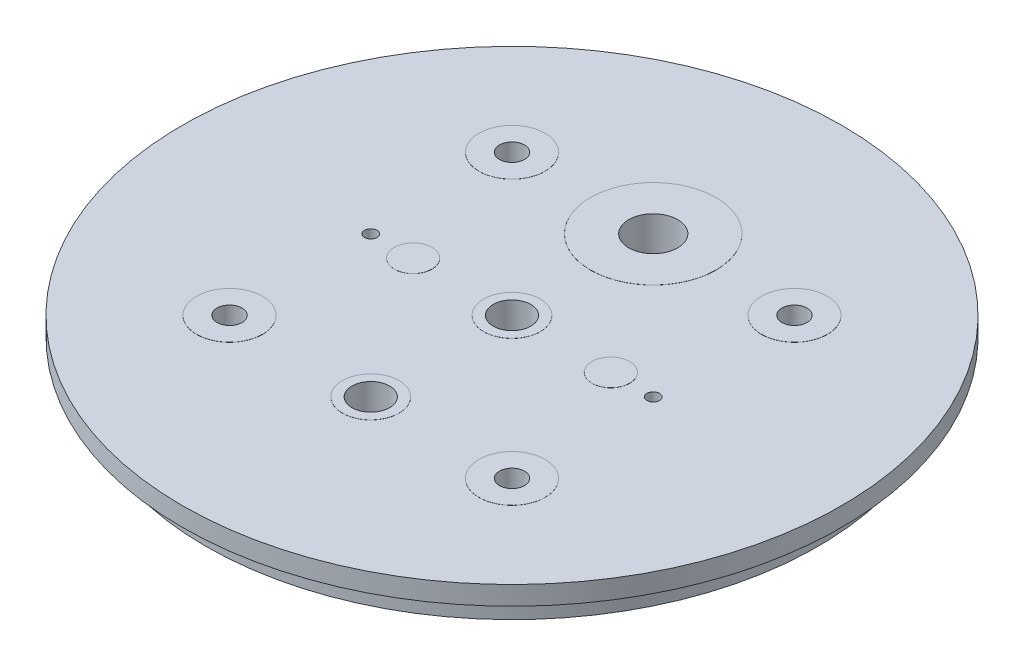
ISO-10303-21;
HEADER;
FILE_DESCRIPTION(('STEP AP214'),'2;1');
FILE_NAME('part.step','',(''),(''),'','','');
FILE_SCHEMA(('AUTOMOTIVE_DESIGN { 1 0 10303 214 1 1 1 1 }'));
ENDSEC;
DATA;
#1=APPLICATION_CONTEXT('core data for automotive mechanical design processes');
#2=APPLICATION_PROTOCOL_DEFINITION('international standard','automotive_design',2000,#1);
#3=PRODUCT_CONTEXT('',#1,'mechanical');
#4=PRODUCT('Part','Part','',(#3));
#5=PRODUCT_RELATED_PRODUCT_CATEGORY('part','',(#4));
#6=PRODUCT_DEFINITION_FORMATION('','',#4);
#7=PRODUCT_DEFINITION_CONTEXT('part definition',#1,'design');
#8=PRODUCT_DEFINITION('design','',#6,#7);
#9=PRODUCT_DEFINITION_SHAPE('','',#8);
#10=(LENGTH_UNIT() NAMED_UNIT(*) SI_UNIT(.MILLI.,.METRE.));
#11=(NAMED_UNIT(*) PLANE_ANGLE_UNIT() SI_UNIT($,.RADIAN.));
#12=(NAMED_UNIT(*) SI_UNIT($,.STERADIAN.) SOLID_ANGLE_UNIT());
#13=UNCERTAINTY_MEASURE_WITH_UNIT(LENGTH_MEASURE(1.E-05),#10,'distance_accuracy_value','');
#14=(GEOMETRIC_REPRESENTATION_CONTEXT(3) GLOBAL_UNCERTAINTY_ASSIGNED_CONTEXT((#13)) GLOBAL_UNIT_ASSIGNED_CONTEXT((#10,
#11,#12)) REPRESENTATION_CONTEXT('',''));
#15=CARTESIAN_POINT('',(0.,0.,0.));
#16=DIRECTION('',(0.,0.,1.));
#17=DIRECTION('',(1.,0.,0.));
#18=AXIS2_PLACEMENT_3D('',#15,#16,#17);
#19=CARTESIAN_POINT('',(22.4996823848627,36.2233266135934,22.3432986914773));
#20=DIRECTION('',(0.,-1.,0.));
#21=DIRECTION('',(0.,0.,-1.));
#22=AXIS2_PLACEMENT_3D('',#19,#20,#21);
#23=CYLINDRICAL_SURFACE('',#22,2.);
#24=CARTESIAN_POINT('',(22.4996823848627,26.2423537848137,22.3432986914773));
#25=DIRECTION('',(0.,-1.,0.));
#26=DIRECTION('',(1.,0.,0.));
#27=AXIS2_PLACEMENT_3D('',#24,#25,#26);
#28=CIRCLE('',#27,2.);
#29=CARTESIAN_POINT('',(24.4996823848627,26.2423537848137,22.3432986914773));
#30=VERTEX_POINT('',#29);
#31=EDGE_CURVE('E137',#30,#30,#28,.F.);
#32=ORIENTED_EDGE('',*,*,#31,.T.);
#33=EDGE_LOOP('',(#32));
#34=FACE_BOUND('',#33,.T.);
#35=CARTESIAN_POINT('',(22.4996823848627,20.7233240058903,22.3432986914773));
#36=DIRECTION('',(0.,-1.,0.));
#37=DIRECTION('',(1.,0.,0.));
#38=AXIS2_PLACEMENT_3D('',#35,#36,#37);
#39=CIRCLE('',#38,2.);
#40=CARTESIAN_POINT('',(24.4996823848627,20.7233240058903,22.3432986914773));
#41=VERTEX_POINT('',#40);
#42=EDGE_CURVE('E49',#41,#41,#39,.T.);
#43=ORIENTED_EDGE('',*,*,#42,.T.);
#44=EDGE_LOOP('',(#43));
#45=FACE_BOUND('',#44,.T.);
#46=ADVANCED_FACE('F45',(#34,#45),#23,.F.);
#47=CARTESIAN_POINT('',(-22.5003182856895,36.2233266135934,22.3432986914773));
#48=DIRECTION('',(0.,-1.,0.));
#49=DIRECTION('',(0.,0.,-1.));
#50=AXIS2_PLACEMENT_3D('',#47,#48,#49);
#51=CYLINDRICAL_SURFACE('',#50,2.);
#52=CARTESIAN_POINT('',(-22.5003182856895,26.2423537848136,22.3432986914773));
#53=DIRECTION('',(0.,-1.,0.));
#54=DIRECTION('',(1.,0.,0.));
#55=AXIS2_PLACEMENT_3D('',#52,#53,#54);
#56=CIRCLE('',#55,2.);
#57=CARTESIAN_POINT('',(-20.5003182856895,26.2423537848136,22.3432986914773));
#58=VERTEX_POINT('',#57);
#59=EDGE_CURVE('E144',#58,#58,#56,.F.);
#60=ORIENTED_EDGE('',*,*,#59,.T.);
#61=EDGE_LOOP('',(#60));
#62=FACE_BOUND('',#61,.T.);
#63=CARTESIAN_POINT('',(-22.5003182856895,20.7233240058903,22.3432986914773));
#64=DIRECTION('',(0.,-1.,0.));
#65=DIRECTION('',(1.,0.,0.));
#66=AXIS2_PLACEMENT_3D('',#63,#64,#65);
#67=CIRCLE('',#66,2.);
#68=CARTESIAN_POINT('',(-20.5003182856895,20.7233240058903,22.3432986914773));
#69=VERTEX_POINT('',#68);
#70=EDGE_CURVE('E167',#69,#69,#67,.T.);
#71=ORIENTED_EDGE('',*,*,#70,.T.);
#72=EDGE_LOOP('',(#71));
#73=FACE_BOUND('',#72,.T.);
#74=ADVANCED_FACE('F276',(#62,#73),#51,.F.);
#75=CARTESIAN_POINT('',(-22.5003182856895,36.2233266135934,-22.6567019790749));
#76=DIRECTION('',(0.,-1.,0.));
#77=DIRECTION('',(0.,0.,-1.));
#78=AXIS2_PLACEMENT_3D('',#75,#76,#77);
#79=CYLINDRICAL_SURFACE('',#78,2.);
#80=CARTESIAN_POINT('',(-22.5003182856895,26.2423537848136,-22.6567019790749));
#81=DIRECTION('',(0.,-1.,0.));
#82=DIRECTION('',(1.,0.,0.));
#83=AXIS2_PLACEMENT_3D('',#80,#81,#82);
#84=CIRCLE('',#83,2.);
#85=CARTESIAN_POINT('',(-20.5003182856895,26.2423537848136,-22.6567019790749));
#86=VERTEX_POINT('',#85);
#87=EDGE_CURVE('E147',#86,#86,#84,.F.);
#88=ORIENTED_EDGE('',*,*,#87,.T.);
#89=EDGE_LOOP('',(#88));
#90=FACE_BOUND('',#89,.T.);
#91=CARTESIAN_POINT('',(-22.5003182856895,20.7233240058903,-22.6567019790749));
#92=DIRECTION('',(0.,-1.,0.));
#93=DIRECTION('',(1.,0.,0.));
#94=AXIS2_PLACEMENT_3D('',#91,#92,#93);
#95=CIRCLE('',#94,2.);
#96=CARTESIAN_POINT('',(-20.5003182856895,20.7233240058903,-22.6567019790749));
#97=VERTEX_POINT('',#96);
#98=EDGE_CURVE('E164',#97,#97,#95,.T.);
#99=ORIENTED_EDGE('',*,*,#98,.T.);
#100=EDGE_LOOP('',(#99));
#101=FACE_BOUND('',#100,.T.);
#102=ADVANCED_FACE('F282',(#90,#101),#79,.F.);
#103=CARTESIAN_POINT('',(22.4996823848627,36.2233266135934,-22.6567019790749));
#104=DIRECTION('',(0.,-1.,0.));
#105=DIRECTION('',(0.,0.,-1.));
#106=AXIS2_PLACEMENT_3D('',#103,#104,#105);
#107=CYLINDRICAL_SURFACE('',#106,2.);
#108=CARTESIAN_POINT('',(22.4996823848627,26.2423537848137,-22.6567019790749));
#109=DIRECTION('',(0.,-1.,0.));
#110=DIRECTION('',(1.,0.,0.));
#111=AXIS2_PLACEMENT_3D('',#108,#109,#110);
#112=CIRCLE('',#111,2.);
#113=CARTESIAN_POINT('',(24.4996823848627,26.2423537848137,-22.6567019790749));
#114=VERTEX_POINT('',#113);
#115=EDGE_CURVE('E150',#114,#114,#112,.F.);
#116=ORIENTED_EDGE('',*,*,#115,.T.);
#117=EDGE_LOOP('',(#116));
#118=FACE_BOUND('',#117,.T.);
#119=CARTESIAN_POINT('',(22.4996823848627,20.7233240058903,-22.6567019790749));
#120=DIRECTION('',(0.,-1.,0.));
#121=DIRECTION('',(1.,0.,0.));
#122=AXIS2_PLACEMENT_3D('',#119,#120,#121);
#123=CIRCLE('',#122,2.);
#124=CARTESIAN_POINT('',(24.4996823848627,20.7233240058903,-22.6567019790749));
#125=VERTEX_POINT('',#124);
#126=EDGE_CURVE('E161',#125,#125,#123,.T.);
#127=ORIENTED_EDGE('',*,*,#126,.T.);
#128=EDGE_LOOP('',(#127));
#129=FACE_BOUND('',#128,.T.);
#130=ADVANCED_FACE('F578',(#118,#129),#107,.F.);
#131=CARTESIAN_POINT('',(-0.000317950413387203,26.2233266135934,52.3432991385121));
#132=DIRECTION('',(0.,1.,0.));
#133=DIRECTION('',(1.,0.,0.));
#134=AXIS2_PLACEMENT_3D('',#131,#132,#133);
#135=PLANE('',#134);
#136=CARTESIAN_POINT('',(-22.5003182856895,26.2233266135934,-0.15670164379878));
#137=DIRECTION('',(0.,1.,0.));
#138=DIRECTION('',(0.,0.,1.));
#139=AXIS2_PLACEMENT_3D('',#136,#137,#138);
#140=CIRCLE('',#139,1.);
#141=CARTESIAN_POINT('',(-22.5003182856895,26.2233266135934,0.843298356201221));
#142=VERTEX_POINT('',#141);
#143=EDGE_CURVE('E160',#142,#142,#140,.F.);
#144=ORIENTED_EDGE('',*,*,#143,.T.);
#145=EDGE_LOOP('',(#144));
#146=FACE_BOUND('',#145,.T.);
#147=CARTESIAN_POINT('',(22.4996823848627,26.2233266135934,-0.15670164379878));
#148=DIRECTION('',(0.,1.,0.));
#149=DIRECTION('',(0.,0.,1.));
#150=AXIS2_PLACEMENT_3D('',#147,#148,#149);
#151=CIRCLE('',#150,1.);
#152=CARTESIAN_POINT('',(22.4996823848627,26.2233266135934,0.843298356201221));
#153=VERTEX_POINT('',#152);
#154=EDGE_CURVE('E156',#153,#153,#151,.F.);
#155=ORIENTED_EDGE('',*,*,#154,.T.);
#156=EDGE_LOOP('',(#155));
#157=FACE_BOUND('',#156,.T.);
#158=CARTESIAN_POINT('',(-0.00031795041337055,26.2233266135934,-22.6567016437988));
#159=DIRECTION('',(0.,1.,0.));
#160=DIRECTION('',(0.,0.,1.));
#161=AXIS2_PLACEMENT_3D('',#158,#159,#160);
#162=CIRCLE('',#161,10.);
#163=CARTESIAN_POINT('',(-0.00031795041337055,26.2233266135934,-12.6567016437988));
#164=VERTEX_POINT('',#163);
#165=EDGE_CURVE('E11',#164,#164,#162,.T.);
#166=ORIENTED_EDGE('',*,*,#165,.F.);
#167=EDGE_LOOP('',(#166));
#168=FACE_BOUND('',#167,.T.);
#169=CARTESIAN_POINT('',(22.4996823848627,26.2233266135934,22.3432986914773));
#170=DIRECTION('',(0.,1.,0.));
#171=DIRECTION('',(0.,0.,1.));
#172=AXIS2_PLACEMENT_3D('',#169,#170,#171);
#173=CIRCLE('',#172,5.25);
#174=CARTESIAN_POINT('',(22.4996823848627,26.2233266135934,27.5932986914773));
#175=VERTEX_POINT('',#174);
#176=EDGE_CURVE('E55',#175,#175,#173,.T.);
#177=ORIENTED_EDGE('',*,*,#176,.F.);
#178=EDGE_LOOP('',(#177));
#179=FACE_BOUND('',#178,.T.);
#180=CARTESIAN_POINT('',(-22.5003182856895,26.2233266135934,22.3432986914773));
#181=DIRECTION('',(0.,1.,0.));
#182=DIRECTION('',(0.,0.,1.));
#183=AXIS2_PLACEMENT_3D('',#180,#181,#182);
#184=CIRCLE('',#183,5.25);
#185=CARTESIAN_POINT('',(-22.5003182856895,26.2233266135934,27.5932986914773));
#186=VERTEX_POINT('',#185);
#187=EDGE_CURVE('E223',#186,#186,#184,.T.);
#188=ORIENTED_EDGE('',*,*,#187,.F.);
#189=EDGE_LOOP('',(#188));
#190=FACE_BOUND('',#189,.T.);
#191=CARTESIAN_POINT('',(-22.5003182856895,26.2233266135934,-22.6567019790749));
#192=DIRECTION('',(0.,1.,0.));
#193=DIRECTION('',(0.,0.,1.));
#194=AXIS2_PLACEMENT_3D('',#191,#192,#193);
#195=CIRCLE('',#194,5.25);
#196=CARTESIAN_POINT('',(-22.5003182856895,26.2233266135934,-17.4067019790749));
#197=VERTEX_POINT('',#196);
#198=EDGE_CURVE('E107',#197,#197,#195,.T.);
#199=ORIENTED_EDGE('',*,*,#198,.F.);
#200=EDGE_LOOP('',(#199));
#201=FACE_BOUND('',#200,.T.);
#202=CARTESIAN_POINT('',(22.4996823848627,26.2233266135934,-22.6567019790749));
#203=DIRECTION('',(0.,1.,0.));
#204=DIRECTION('',(0.,0.,1.));
#205=AXIS2_PLACEMENT_3D('',#202,#203,#204);
#206=CIRCLE('',#205,5.25);
#207=CARTESIAN_POINT('',(22.4996823848627,26.2233266135934,-17.4067019790749));
#208=VERTEX_POINT('',#207);
#209=EDGE_CURVE('E100',#208,#208,#206,.T.);
#210=ORIENTED_EDGE('',*,*,#209,.F.);
#211=EDGE_LOOP('',(#210));
#212=FACE_BOUND('',#211,.T.);
#213=CARTESIAN_POINT('',(-0.000317950413375546,26.2233266135934,-0.15670164379878));
#214=DIRECTION('',(0.,-1.,0.));
#215=DIRECTION('',(0.,0.,1.));
#216=AXIS2_PLACEMENT_3D('',#213,#214,#215);
#217=CIRCLE('',#216,52.5000007823109);
#218=CARTESIAN_POINT('',(-0.000317950413357459,26.2233266135934,-52.6567014901305));
#219=VERTEX_POINT('',#218);
#220=EDGE_CURVE('E66',#219,#219,#217,.T.);
#221=ORIENTED_EDGE('',*,*,#220,.F.);
#222=EDGE_LOOP('',(#221));
#223=FACE_BOUND('',#222,.T.);
#224=CARTESIAN_POINT('',(-0.000317950413375546,26.2233266135934,-0.15670164379878));
#225=DIRECTION('',(0.,1.,0.));
#226=DIRECTION('',(0.,0.,1.));
#227=AXIS2_PLACEMENT_3D('',#224,#225,#226);
#228=CIRCLE('',#227,4.5);
#229=CARTESIAN_POINT('',(-0.000317950413375546,26.2233266135934,4.34329835620122));
#230=VERTEX_POINT('',#229);
#231=EDGE_CURVE('E199',#230,#230,#228,.T.);
#232=ORIENTED_EDGE('',*,*,#231,.F.);
#233=EDGE_LOOP('',(#232));
#234=FACE_BOUND('',#233,.T.);
#235=CARTESIAN_POINT('',(-0.000317950413380542,26.2233266135934,22.3432986914773));
#236=DIRECTION('',(0.,1.,0.));
#237=DIRECTION('',(0.,0.,1.));
#238=AXIS2_PLACEMENT_3D('',#235,#236,#237);
#239=CIRCLE('',#238,4.5);
#240=CARTESIAN_POINT('',(-0.000317950413380542,26.2233266135934,26.8432986914773));
#241=VERTEX_POINT('',#240);
#242=EDGE_CURVE('E226',#241,#241,#239,.T.);
#243=ORIENTED_EDGE('',*,*,#242,.F.);
#244=EDGE_LOOP('',(#243));
#245=FACE_BOUND('',#244,.T.);
#246=CARTESIAN_POINT('',(-15.7503181851067,26.2233266135934,-0.15670164379878));
#247=DIRECTION('',(0.,1.,0.));
#248=DIRECTION('',(0.,0.,1.));
#249=AXIS2_PLACEMENT_3D('',#246,#247,#248);
#250=CIRCLE('',#249,3.00000004470348);
#251=CARTESIAN_POINT('',(-15.7503181851067,26.2233266135934,2.8432984009047));
#252=VERTEX_POINT('',#251);
#253=EDGE_CURVE('E213',#252,#252,#250,.T.);
#254=ORIENTED_EDGE('',*,*,#253,.F.);
#255=EDGE_LOOP('',(#254));
#256=FACE_BOUND('',#255,.T.);
#257=CARTESIAN_POINT('',(15.7496822842799,26.2233266135934,-0.15670164379878));
#258=DIRECTION('',(0.,1.,0.));
#259=DIRECTION('',(0.,0.,1.));
#260=AXIS2_PLACEMENT_3D('',#257,#258,#259);
#261=CIRCLE('',#260,3.00000004470345);
#262=CARTESIAN_POINT('',(15.7496822842799,26.2233266135934,2.84329840090467));
#263=VERTEX_POINT('',#262);
#264=EDGE_CURVE('E206',#263,#263,#261,.T.);
#265=ORIENTED_EDGE('',*,*,#264,.F.);
#266=EDGE_LOOP('',(#265));
#267=FACE_BOUND('',#266,.T.);
#268=ADVANCED_FACE('F586',(#146,#157,#168,#179,#190,#201,#212,#223,#234,#245,#256,#267),#135,.T.);
#269=CARTESIAN_POINT('',(-0.000317950413375809,23.2233253004286,7.34329874735694));
#270=DIRECTION('',(0.,-1.,0.));
#271=DIRECTION('',(0.,0.,-1.));
#272=AXIS2_PLACEMENT_3D('',#269,#270,#271);
#273=PLANE('',#272);
#274=CARTESIAN_POINT('',(-0.000317950413374144,23.2233253004286,-0.15670164379878));
#275=DIRECTION('',(0.,1.,0.));
#276=DIRECTION('',(0.,0.,1.));
#277=AXIS2_PLACEMENT_3D('',#274,#275,#276);
#278=CIRCLE('',#277,10.5000001564622);
#279=CARTESIAN_POINT('',(-0.000317950413370526,23.2233253004286,-10.656701800261));
#280=VERTEX_POINT('',#279);
#281=EDGE_CURVE('E120',#280,#280,#278,.T.);
#282=ORIENTED_EDGE('',*,*,#281,.F.);
#283=EDGE_LOOP('',(#282));
#284=FACE_BOUND('',#283,.T.);
#285=CARTESIAN_POINT('',(-0.000317950413374144,23.2233253004286,-0.15670164379878));
#286=DIRECTION('',(0.,-1.,0.));
#287=DIRECTION('',(0.,0.,1.));
#288=AXIS2_PLACEMENT_3D('',#285,#286,#287);
#289=CIRCLE('',#288,7.50000039115572);
#290=CARTESIAN_POINT('',(-0.00031795041337156,23.2233253004286,-7.65670203495432));
#291=VERTEX_POINT('',#290);
#292=EDGE_CURVE('E114',#291,#291,#289,.T.);
#293=ORIENTED_EDGE('',*,*,#292,.F.);
#294=EDGE_LOOP('',(#293));
#295=FACE_BOUND('',#294,.T.);
#296=ADVANCED_FACE('F597',(#284,#295),#273,.T.);
#297=CARTESIAN_POINT('',(-0.000317950413369533,11.223326390076,4.34329842325644));
#298=DIRECTION('',(0.,-1.,0.));
#299=DIRECTION('',(0.,0.,-1.));
#300=AXIS2_PLACEMENT_3D('',#297,#298,#299);
#301=PLANE('',#300);
#302=CARTESIAN_POINT('',(-0.000317950413375546,11.223326390076,-0.15670164379878));
#303=DIRECTION('',(0.,1.,0.));
#304=DIRECTION('',(0.,0.,1.));
#305=AXIS2_PLACEMENT_3D('',#302,#303,#304);
#306=CIRCLE('',#305,3.);
#307=CARTESIAN_POINT('',(-0.000317950413375546,11.223326390076,2.84329835620122));
#308=VERTEX_POINT('',#307);
#309=EDGE_CURVE('E136',#308,#308,#306,.T.);
#310=ORIENTED_EDGE('',*,*,#309,.T.);
#311=EDGE_LOOP('',(#310));
#312=FACE_BOUND('',#311,.T.);
#313=CARTESIAN_POINT('',(-0.000317950413368534,11.223326390076,-0.15670164379878));
#314=DIRECTION('',(0.,-1.,0.));
#315=DIRECTION('',(0.,0.,1.));
#316=AXIS2_PLACEMENT_3D('',#313,#314,#315);
#317=CIRCLE('',#316,7.50000039115552);
#318=CARTESIAN_POINT('',(-0.00031795041336595,11.223326390076,-7.65670203495432));
#319=VERTEX_POINT('',#318);
#320=EDGE_CURVE('E94',#319,#319,#317,.T.);
#321=ORIENTED_EDGE('',*,*,#320,.T.);
#322=EDGE_LOOP('',(#321));
#323=FACE_BOUND('',#322,.T.);
#324=ADVANCED_FACE('F592',(#312,#323),#301,.T.);
#325=CARTESIAN_POINT('',(-0.000317950413374845,24.723325948629,-0.15670164379878));
#326=DIRECTION('',(0.,-1.,0.));
#327=DIRECTION('',(0.,0.,1.));
#328=AXIS2_PLACEMENT_3D('',#325,#326,#327);
#329=CYLINDRICAL_SURFACE('',#328,52.4999998463317);
#330=CARTESIAN_POINT('',(-0.000317950413374144,23.2233252836647,-0.15670164379878));
#331=DIRECTION('',(0.,-1.,0.));
#332=DIRECTION('',(0.,0.,1.));
#333=AXIS2_PLACEMENT_3D('',#330,#331,#332);
#334=CIRCLE('',#333,52.4999989103526);
#335=CARTESIAN_POINT('',(-0.000317950413356057,23.2233252836647,-52.6567014901305));
#336=VERTEX_POINT('',#335);
#337=EDGE_CURVE('E123',#336,#336,#334,.T.);
#338=ORIENTED_EDGE('',*,*,#337,.F.);
#339=DIRECTION('',(0.,1.,0.));
#340=VECTOR('',#339,1.);
#341=CARTESIAN_POINT('',(-0.000317950413356758,24.723325948629,-52.6567014901305));
#342=LINE('',#341,#340);
#343=EDGE_CURVE('E101',#336,#219,#342,.T.);
#344=ORIENTED_EDGE('',*,*,#343,.T.);
#345=ORIENTED_EDGE('',*,*,#220,.T.);
#346=ORIENTED_EDGE('',*,*,#343,.F.);
#347=EDGE_LOOP('',(#338,#344,#345,#346));
#348=FACE_BOUND('',#347,.T.);
#349=ADVANCED_FACE('F363',(#348),#329,.T.);
#350=CARTESIAN_POINT('',(-0.000317950413384968,23.2233252836647,48.5932972665538));
#351=DIRECTION('',(0.,-1.,0.));
#352=DIRECTION('',(0.,0.,-1.));
#353=AXIS2_PLACEMENT_3D('',#350,#351,#352);
#354=PLANE('',#353);
#355=ORIENTED_EDGE('',*,*,#337,.T.);
#356=EDGE_LOOP('',(#355));
#357=FACE_BOUND('',#356,.T.);
#358=CARTESIAN_POINT('',(-0.000317950413374144,23.2233252836647,-0.15670164379878));
#359=DIRECTION('',(0.,-1.,0.));
#360=DIRECTION('',(0.,0.,1.));
#361=AXIS2_PLACEMENT_3D('',#358,#359,#360);
#362=CIRCLE('',#361,48.7499989103526);
#363=CARTESIAN_POINT('',(-0.000317950413357349,23.2233252836647,-48.9067005541514));
#364=VERTEX_POINT('',#363);
#365=EDGE_CURVE('E131',#364,#364,#362,.T.);
#366=ORIENTED_EDGE('',*,*,#365,.F.);
#367=EDGE_LOOP('',(#366));
#368=FACE_BOUND('',#367,.T.);
#369=ADVANCED_FACE('F269',(#357,#368),#354,.T.);
#370=CARTESIAN_POINT('',(-0.000317950413373092,20.9733246447775,-0.15670164379878));
#371=DIRECTION('',(0.,-1.,0.));
#372=DIRECTION('',(0.,0.,1.));
#373=AXIS2_PLACEMENT_3D('',#370,#371,#372);
#374=CYLINDRICAL_SURFACE('',#373,48.7499989103526);
#375=CARTESIAN_POINT('',(-0.00031795041337204,18.7233240058902,-0.15670164379878));
#376=DIRECTION('',(0.,-1.,0.));
#377=DIRECTION('',(0.,0.,1.));
#378=AXIS2_PLACEMENT_3D('',#375,#376,#377);
#379=CIRCLE('',#378,48.7499989103526);
#380=CARTESIAN_POINT('',(-0.000317950413355245,18.7233240058902,-48.9067005541514));
#381=VERTEX_POINT('',#380);
#382=EDGE_CURVE('E127',#381,#381,#379,.T.);
#383=ORIENTED_EDGE('',*,*,#382,.F.);
#384=DIRECTION('',(0.,1.,0.));
#385=VECTOR('',#384,1.);
#386=CARTESIAN_POINT('',(-0.000317950413356297,20.9733246447775,-48.9067005541514));
#387=LINE('',#386,#385);
#388=EDGE_CURVE('E248',#381,#364,#387,.T.);
#389=ORIENTED_EDGE('',*,*,#388,.T.);
#390=ORIENTED_EDGE('',*,*,#365,.T.);
#391=ORIENTED_EDGE('',*,*,#388,.F.);
#392=EDGE_LOOP('',(#383,#389,#390,#391));
#393=FACE_BOUND('',#392,.T.);
#394=ADVANCED_FACE('F262',(#393),#374,.T.);
#395=CARTESIAN_POINT('',(-0.000317950413374372,18.7233240058903,10.3432985126634));
#396=DIRECTION('',(0.,-1.,0.));
#397=DIRECTION('',(0.,0.,-1.));
#398=AXIS2_PLACEMENT_3D('',#395,#396,#397);
#399=PLANE('',#398);
#400=CARTESIAN_POINT('',(22.4996823848627,18.7233240058903,22.3432986914773));
#401=DIRECTION('',(0.,-1.,0.));
#402=DIRECTION('',(1.,0.,0.));
#403=AXIS2_PLACEMENT_3D('',#400,#401,#402);
#404=CIRCLE('',#403,3.5);
#405=CARTESIAN_POINT('',(25.9996823848627,18.7233240058903,22.3432986914773));
#406=VERTEX_POINT('',#405);
#407=EDGE_CURVE('E827',#406,#406,#404,.T.);
#408=ORIENTED_EDGE('',*,*,#407,.F.);
#409=EDGE_LOOP('',(#408));
#410=FACE_BOUND('',#409,.T.);
#411=CARTESIAN_POINT('',(-22.5003182856895,18.7233240058903,22.3432986914773));
#412=DIRECTION('',(0.,-1.,0.));
#413=DIRECTION('',(1.,0.,0.));
#414=AXIS2_PLACEMENT_3D('',#411,#412,#413);
#415=CIRCLE('',#414,3.5);
#416=CARTESIAN_POINT('',(-19.0003182856895,18.7233240058903,22.3432986914773));
#417=VERTEX_POINT('',#416);
#418=EDGE_CURVE('E833',#417,#417,#415,.T.);
#419=ORIENTED_EDGE('',*,*,#418,.F.);
#420=EDGE_LOOP('',(#419));
#421=FACE_BOUND('',#420,.T.);
#422=CARTESIAN_POINT('',(-22.5003182856895,18.7233240058903,-22.6567019790749));
#423=DIRECTION('',(0.,-1.,0.));
#424=DIRECTION('',(1.,0.,0.));
#425=AXIS2_PLACEMENT_3D('',#422,#423,#424);
#426=CIRCLE('',#425,3.5);
#427=CARTESIAN_POINT('',(-19.0003182856895,18.7233240058903,-22.6567019790749));
#428=VERTEX_POINT('',#427);
#429=EDGE_CURVE('E839',#428,#428,#426,.T.);
#430=ORIENTED_EDGE('',*,*,#429,.F.);
#431=EDGE_LOOP('',(#430));
#432=FACE_BOUND('',#431,.T.);
#433=CARTESIAN_POINT('',(22.4996823848627,18.7233240058903,-22.6567019790749));
#434=DIRECTION('',(0.,-1.,0.));
#435=DIRECTION('',(1.,0.,0.));
#436=AXIS2_PLACEMENT_3D('',#433,#434,#435);
#437=CIRCLE('',#436,3.5);
#438=CARTESIAN_POINT('',(25.9996823848627,18.7233240058903,-22.6567019790749));
#439=VERTEX_POINT('',#438);
#440=EDGE_CURVE('E182',#439,#439,#437,.T.);
#441=ORIENTED_EDGE('',*,*,#440,.F.);
#442=EDGE_LOOP('',(#441));
#443=FACE_BOUND('',#442,.T.);
#444=CARTESIAN_POINT('',(-0.000317950413380542,18.7233240058903,22.3432986914773));
#445=DIRECTION('',(0.,-1.,0.));
#446=DIRECTION('',(1.,0.,0.));
#447=AXIS2_PLACEMENT_3D('',#444,#445,#446);
#448=CIRCLE('',#447,3.);
#449=CARTESIAN_POINT('',(2.99968204958662,18.7233240058903,22.3432986914773));
#450=VERTEX_POINT('',#449);
#451=EDGE_CURVE('E143',#450,#450,#448,.F.);
#452=ORIENTED_EDGE('',*,*,#451,.T.);
#453=EDGE_LOOP('',(#452));
#454=FACE_BOUND('',#453,.T.);
#455=CARTESIAN_POINT('',(-0.00031795041337055,18.7233240058903,-22.6567016437988));
#456=DIRECTION('',(0.,-1.,0.));
#457=DIRECTION('',(1.,0.,0.));
#458=AXIS2_PLACEMENT_3D('',#455,#456,#457);
#459=CIRCLE('',#458,3.9);
#460=CARTESIAN_POINT('',(3.89968204958663,18.7233240058903,-22.6567016437988));
#461=VERTEX_POINT('',#460);
#462=EDGE_CURVE('E135',#461,#461,#459,.F.);
#463=ORIENTED_EDGE('',*,*,#462,.T.);
#464=EDGE_LOOP('',(#463));
#465=FACE_BOUND('',#464,.T.);
#466=CARTESIAN_POINT('',(-22.5003182856895,18.7233240058903,-0.15670164379878));
#467=DIRECTION('',(0.,-1.,0.));
#468=DIRECTION('',(1.,0.,0.));
#469=AXIS2_PLACEMENT_3D('',#466,#467,#468);
#470=CIRCLE('',#469,1.);
#471=CARTESIAN_POINT('',(-21.5003182856895,18.7233240058903,-0.15670164379878));
#472=VERTEX_POINT('',#471);
#473=EDGE_CURVE('E157',#472,#472,#470,.F.);
#474=ORIENTED_EDGE('',*,*,#473,.T.);
#475=EDGE_LOOP('',(#474));
#476=FACE_BOUND('',#475,.T.);
#477=CARTESIAN_POINT('',(22.4996823848627,18.7233240058903,-0.15670164379878));
#478=DIRECTION('',(0.,-1.,0.));
#479=DIRECTION('',(1.,0.,0.));
#480=AXIS2_PLACEMENT_3D('',#477,#478,#479);
#481=CIRCLE('',#480,1.);
#482=CARTESIAN_POINT('',(23.4996823848627,18.7233240058903,-0.15670164379878));
#483=VERTEX_POINT('',#482);
#484=EDGE_CURVE('E153',#483,#483,#481,.F.);
#485=ORIENTED_EDGE('',*,*,#484,.T.);
#486=EDGE_LOOP('',(#485));
#487=FACE_BOUND('',#486,.T.);
#488=ORIENTED_EDGE('',*,*,#382,.T.);
#489=EDGE_LOOP('',(#488));
#490=FACE_BOUND('',#489,.T.);
#491=CARTESIAN_POINT('',(-0.00031795041337204,18.7233240058903,-0.15670164379878));
#492=DIRECTION('',(0.,-1.,0.));
#493=DIRECTION('',(0.,0.,1.));
#494=AXIS2_PLACEMENT_3D('',#491,#492,#493);
#495=CIRCLE('',#494,10.5000001564622);
#496=CARTESIAN_POINT('',(-0.000317950413368423,18.7233240058903,-10.656701800261));
#497=VERTEX_POINT('',#496);
#498=EDGE_CURVE('E119',#497,#497,#495,.T.);
#499=ORIENTED_EDGE('',*,*,#498,.F.);
#500=EDGE_LOOP('',(#499));
#501=FACE_BOUND('',#500,.T.);
#502=ADVANCED_FACE('F260',(#410,#421,#432,#443,#454,#465,#476,#487,#490,#501),#399,.T.);
#503=CARTESIAN_POINT('',(-0.000317950413372917,20.5983246531594,-0.15670164379878));
#504=DIRECTION('',(0.,-1.,0.));
#505=DIRECTION('',(0.,0.,1.));
#506=AXIS2_PLACEMENT_3D('',#503,#504,#505);
#507=CYLINDRICAL_SURFACE('',#506,10.5000001564622);
#508=ORIENTED_EDGE('',*,*,#498,.T.);
#509=DIRECTION('',(0.,1.,0.));
#510=VECTOR('',#509,1.);
#511=CARTESIAN_POINT('',(-0.000317950413369299,20.5983246531594,-10.656701800261));
#512=LINE('',#511,#510);
#513=EDGE_CURVE('E116',#497,#280,#512,.T.);
#514=ORIENTED_EDGE('',*,*,#513,.T.);
#515=ORIENTED_EDGE('',*,*,#281,.T.);
#516=ORIENTED_EDGE('',*,*,#513,.F.);
#517=EDGE_LOOP('',(#508,#514,#515,#516));
#518=FACE_BOUND('',#517,.T.);
#519=ADVANCED_FACE('F47',(#518),#507,.F.);
#520=CARTESIAN_POINT('',(-0.000317950413371164,16.8483258452523,-0.15670164379878));
#521=DIRECTION('',(0.,-1.,0.));
#522=DIRECTION('',(0.,0.,1.));
#523=AXIS2_PLACEMENT_3D('',#520,#521,#522);
#524=CYLINDRICAL_SURFACE('',#523,7.50000039115554);
#525=ORIENTED_EDGE('',*,*,#320,.F.);
#526=DIRECTION('',(0.,1.,0.));
#527=VECTOR('',#526,1.);
#528=CARTESIAN_POINT('',(-0.00031795041336858,16.8483258452523,-7.65670203495432));
#529=LINE('',#528,#527);
#530=EDGE_CURVE('E97',#319,#291,#529,.T.);
#531=ORIENTED_EDGE('',*,*,#530,.T.);
#532=ORIENTED_EDGE('',*,*,#292,.T.);
#533=ORIENTED_EDGE('',*,*,#530,.F.);
#534=EDGE_LOOP('',(#525,#531,#532,#533));
#535=FACE_BOUND('',#534,.T.);
#536=ADVANCED_FACE('F95',(#535),#524,.T.);
#537=CARTESIAN_POINT('',(22.4996823848627,26.2423537848137,-22.6567019790749));
#538=DIRECTION('',(0.,-1.,0.));
#539=DIRECTION('',(1.,0.,0.));
#540=AXIS2_PLACEMENT_3D('',#537,#538,#539);
#541=CYLINDRICAL_SURFACE('',#540,5.25);
#542=ORIENTED_EDGE('',*,*,#209,.T.);
#543=EDGE_LOOP('',(#542));
#544=FACE_BOUND('',#543,.T.);
#545=CARTESIAN_POINT('',(22.4996823848627,26.2423537848137,-22.6567019790749));
#546=DIRECTION('',(0.,-1.,0.));
#547=DIRECTION('',(1.,0.,0.));
#548=AXIS2_PLACEMENT_3D('',#545,#546,#547);
#549=CIRCLE('',#548,5.25);
#550=CARTESIAN_POINT('',(27.7496823848627,26.2423537848137,-22.6567019790749));
#551=VERTEX_POINT('',#550);
#552=EDGE_CURVE('E238',#551,#551,#549,.T.);
#553=ORIENTED_EDGE('',*,*,#552,.T.);
#554=EDGE_LOOP('',(#553));
#555=FACE_BOUND('',#554,.T.);
#556=ADVANCED_FACE('F357',(#544,#555),#541,.T.);
#557=CARTESIAN_POINT('',(22.4996823848627,26.2423537848137,-22.6567019790749));
#558=DIRECTION('',(0.,-1.,0.));
#559=DIRECTION('',(1.,0.,0.));
#560=AXIS2_PLACEMENT_3D('',#557,#558,#559);
#561=PLANE('',#560);
#562=ORIENTED_EDGE('',*,*,#115,.F.);
#563=EDGE_LOOP('',(#562));
#564=FACE_BOUND('',#563,.T.);
#565=ORIENTED_EDGE('',*,*,#552,.F.);
#566=EDGE_LOOP('',(#565));
#567=FACE_BOUND('',#566,.T.);
#568=ADVANCED_FACE('F353',(#564,#567),#561,.F.);
#569=CARTESIAN_POINT('',(-22.5003182856895,26.2423537848136,-22.6567019790749));
#570=DIRECTION('',(0.,-1.,0.));
#571=DIRECTION('',(1.,0.,0.));
#572=AXIS2_PLACEMENT_3D('',#569,#570,#571);
#573=CYLINDRICAL_SURFACE('',#572,5.25);
#574=ORIENTED_EDGE('',*,*,#198,.T.);
#575=EDGE_LOOP('',(#574));
#576=FACE_BOUND('',#575,.T.);
#577=CARTESIAN_POINT('',(-22.5003182856895,26.2423537848136,-22.6567019790749));
#578=DIRECTION('',(0.,-1.,0.));
#579=DIRECTION('',(1.,0.,0.));
#580=AXIS2_PLACEMENT_3D('',#577,#578,#579);
#581=CIRCLE('',#580,5.25);
#582=CARTESIAN_POINT('',(-17.2503182856895,26.2423537848136,-22.6567019790749));
#583=VERTEX_POINT('',#582);
#584=EDGE_CURVE('E233',#583,#583,#581,.T.);
#585=ORIENTED_EDGE('',*,*,#584,.T.);
#586=EDGE_LOOP('',(#585));
#587=FACE_BOUND('',#586,.T.);
#588=ADVANCED_FACE('F349',(#576,#587),#573,.T.);
#589=CARTESIAN_POINT('',(-22.5003182856895,26.2423537848136,-22.6567019790749));
#590=DIRECTION('',(0.,-1.,0.));
#591=DIRECTION('',(1.,0.,0.));
#592=AXIS2_PLACEMENT_3D('',#589,#590,#591);
#593=PLANE('',#592);
#594=ORIENTED_EDGE('',*,*,#87,.F.);
#595=EDGE_LOOP('',(#594));
#596=FACE_BOUND('',#595,.T.);
#597=ORIENTED_EDGE('',*,*,#584,.F.);
#598=EDGE_LOOP('',(#597));
#599=FACE_BOUND('',#598,.T.);
#600=ADVANCED_FACE('F345',(#596,#599),#593,.F.);
#601=CARTESIAN_POINT('',(-22.5003182856895,26.2423537848136,22.3432986914773));
#602=DIRECTION('',(0.,-1.,0.));
#603=DIRECTION('',(1.,0.,0.));
#604=AXIS2_PLACEMENT_3D('',#601,#602,#603);
#605=CYLINDRICAL_SURFACE('',#604,5.25);
#606=ORIENTED_EDGE('',*,*,#187,.T.);
#607=EDGE_LOOP('',(#606));
#608=FACE_BOUND('',#607,.T.);
#609=CARTESIAN_POINT('',(-22.5003182856895,26.2423537848136,22.3432986914773));
#610=DIRECTION('',(0.,-1.,0.));
#611=DIRECTION('',(1.,0.,0.));
#612=AXIS2_PLACEMENT_3D('',#609,#610,#611);
#613=CIRCLE('',#612,5.25);
#614=CARTESIAN_POINT('',(-17.2503182856895,26.2423537848136,22.3432986914773));
#615=VERTEX_POINT('',#614);
#616=EDGE_CURVE('E230',#615,#615,#613,.T.);
#617=ORIENTED_EDGE('',*,*,#616,.T.);
#618=EDGE_LOOP('',(#617));
#619=FACE_BOUND('',#618,.T.);
#620=ADVANCED_FACE('F341',(#608,#619),#605,.T.);
#621=CARTESIAN_POINT('',(-22.5003182856895,26.2423537848136,22.3432986914773));
#622=DIRECTION('',(0.,-1.,0.));
#623=DIRECTION('',(1.,0.,0.));
#624=AXIS2_PLACEMENT_3D('',#621,#622,#623);
#625=PLANE('',#624);
#626=ORIENTED_EDGE('',*,*,#59,.F.);
#627=EDGE_LOOP('',(#626));
#628=FACE_BOUND('',#627,.T.);
#629=ORIENTED_EDGE('',*,*,#616,.F.);
#630=EDGE_LOOP('',(#629));
#631=FACE_BOUND('',#630,.T.);
#632=ADVANCED_FACE('F337',(#628,#631),#625,.F.);
#633=CARTESIAN_POINT('',(-0.000317950413380551,26.2423537848136,22.3432986914773));
#634=DIRECTION('',(0.,-1.,0.));
#635=DIRECTION('',(1.,0.,0.));
#636=AXIS2_PLACEMENT_3D('',#633,#634,#635);
#637=CYLINDRICAL_SURFACE('',#636,4.5);
#638=ORIENTED_EDGE('',*,*,#242,.T.);
#639=EDGE_LOOP('',(#638));
#640=FACE_BOUND('',#639,.T.);
#641=CARTESIAN_POINT('',(-0.000317950413380551,26.2423537848136,22.3432986914773));
#642=DIRECTION('',(0.,-1.,0.));
#643=DIRECTION('',(1.,0.,0.));
#644=AXIS2_PLACEMENT_3D('',#641,#642,#643);
#645=CIRCLE('',#644,4.5);
#646=CARTESIAN_POINT('',(4.49968204958662,26.2423537848136,22.3432986914773));
#647=VERTEX_POINT('',#646);
#648=EDGE_CURVE('E220',#647,#647,#645,.T.);
#649=ORIENTED_EDGE('',*,*,#648,.T.);
#650=EDGE_LOOP('',(#649));
#651=FACE_BOUND('',#650,.T.);
#652=ADVANCED_FACE('F333',(#640,#651),#637,.T.);
#653=CARTESIAN_POINT('',(-0.000317950413380551,26.2423537848136,22.3432986914773));
#654=DIRECTION('',(0.,-1.,0.));
#655=DIRECTION('',(1.,0.,0.));
#656=AXIS2_PLACEMENT_3D('',#653,#654,#655);
#657=PLANE('',#656);
#658=CARTESIAN_POINT('',(-0.000317950413380542,26.2423537848136,22.3432986914773));
#659=DIRECTION('',(0.,-1.,0.));
#660=DIRECTION('',(1.,0.,0.));
#661=AXIS2_PLACEMENT_3D('',#658,#659,#660);
#662=CIRCLE('',#661,3.);
#663=CARTESIAN_POINT('',(2.99968204958662,26.2423537848136,22.3432986914773));
#664=VERTEX_POINT('',#663);
#665=EDGE_CURVE('E140',#664,#664,#662,.F.);
#666=ORIENTED_EDGE('',*,*,#665,.F.);
#667=EDGE_LOOP('',(#666));
#668=FACE_BOUND('',#667,.T.);
#669=ORIENTED_EDGE('',*,*,#648,.F.);
#670=EDGE_LOOP('',(#669));
#671=FACE_BOUND('',#670,.T.);
#672=ADVANCED_FACE('F329',(#668,#671),#657,.F.);
#673=CARTESIAN_POINT('',(22.4996823848627,26.2423537848137,22.3432986914773));
#674=DIRECTION('',(0.,-1.,0.));
#675=DIRECTION('',(1.,0.,0.));
#676=AXIS2_PLACEMENT_3D('',#673,#674,#675);
#677=CYLINDRICAL_SURFACE('',#676,5.25);
#678=ORIENTED_EDGE('',*,*,#176,.T.);
#679=EDGE_LOOP('',(#678));
#680=FACE_BOUND('',#679,.T.);
#681=CARTESIAN_POINT('',(22.4996823848627,26.2423537848137,22.3432986914773));
#682=DIRECTION('',(0.,-1.,0.));
#683=DIRECTION('',(1.,0.,0.));
#684=AXIS2_PLACEMENT_3D('',#681,#682,#683);
#685=CIRCLE('',#684,5.25);
#686=CARTESIAN_POINT('',(27.7496823848627,26.2423537848137,22.3432986914773));
#687=VERTEX_POINT('',#686);
#688=EDGE_CURVE('E217',#687,#687,#685,.T.);
#689=ORIENTED_EDGE('',*,*,#688,.T.);
#690=EDGE_LOOP('',(#689));
#691=FACE_BOUND('',#690,.T.);
#692=ADVANCED_FACE('F325',(#680,#691),#677,.T.);
#693=CARTESIAN_POINT('',(22.4996823848627,26.2423537848137,22.3432986914773));
#694=DIRECTION('',(0.,-1.,0.));
#695=DIRECTION('',(1.,0.,0.));
#696=AXIS2_PLACEMENT_3D('',#693,#694,#695);
#697=PLANE('',#696);
#698=ORIENTED_EDGE('',*,*,#31,.F.);
#699=EDGE_LOOP('',(#698));
#700=FACE_BOUND('',#699,.T.);
#701=ORIENTED_EDGE('',*,*,#688,.F.);
#702=EDGE_LOOP('',(#701));
#703=FACE_BOUND('',#702,.T.);
#704=ADVANCED_FACE('F321',(#700,#703),#697,.F.);
#705=CARTESIAN_POINT('',(-15.7503181851067,26.2423537848136,-0.15670164379878));
#706=DIRECTION('',(0.,-1.,0.));
#707=DIRECTION('',(1.,0.,0.));
#708=AXIS2_PLACEMENT_3D('',#705,#706,#707);
#709=CYLINDRICAL_SURFACE('',#708,3.00000004470348);
#710=ORIENTED_EDGE('',*,*,#253,.T.);
#711=EDGE_LOOP('',(#710));
#712=FACE_BOUND('',#711,.T.);
#713=CARTESIAN_POINT('',(-15.7503181851067,26.2423537848136,-0.15670164379878));
#714=DIRECTION('',(0.,-1.,0.));
#715=DIRECTION('',(1.,0.,0.));
#716=AXIS2_PLACEMENT_3D('',#713,#714,#715);
#717=CIRCLE('',#716,3.00000004470348);
#718=CARTESIAN_POINT('',(-12.7503181404032,26.2423537848136,-0.15670164379878));
#719=VERTEX_POINT('',#718);
#720=EDGE_CURVE('E210',#719,#719,#717,.T.);
#721=ORIENTED_EDGE('',*,*,#720,.T.);
#722=EDGE_LOOP('',(#721));
#723=FACE_BOUND('',#722,.T.);
#724=ADVANCED_FACE('F317',(#712,#723),#709,.T.);
#725=CARTESIAN_POINT('',(-15.7503181851067,26.2423537848136,-0.15670164379878));
#726=DIRECTION('',(0.,-1.,0.));
#727=DIRECTION('',(1.,0.,0.));
#728=AXIS2_PLACEMENT_3D('',#725,#726,#727);
#729=PLANE('',#728);
#730=ORIENTED_EDGE('',*,*,#720,.F.);
#731=EDGE_LOOP('',(#730));
#732=FACE_BOUND('',#731,.T.);
#733=ADVANCED_FACE('F313',(#732),#729,.F.);
#734=CARTESIAN_POINT('',(15.7496822842799,26.2423537848136,-0.15670164379878));
#735=DIRECTION('',(0.,-1.,0.));
#736=DIRECTION('',(1.,0.,0.));
#737=AXIS2_PLACEMENT_3D('',#734,#735,#736);
#738=CYLINDRICAL_SURFACE('',#737,3.00000004470345);
#739=ORIENTED_EDGE('',*,*,#264,.T.);
#740=EDGE_LOOP('',(#739));
#741=FACE_BOUND('',#740,.T.);
#742=CARTESIAN_POINT('',(15.7496822842799,26.2423537848136,-0.15670164379878));
#743=DIRECTION('',(0.,-1.,0.));
#744=DIRECTION('',(1.,0.,0.));
#745=AXIS2_PLACEMENT_3D('',#742,#743,#744);
#746=CIRCLE('',#745,3.00000004470345);
#747=CARTESIAN_POINT('',(18.7496823289834,26.2423537848136,-0.15670164379878));
#748=VERTEX_POINT('',#747);
#749=EDGE_CURVE('E203',#748,#748,#746,.T.);
#750=ORIENTED_EDGE('',*,*,#749,.T.);
#751=EDGE_LOOP('',(#750));
#752=FACE_BOUND('',#751,.T.);
#753=ADVANCED_FACE('F309',(#741,#752),#738,.T.);
#754=CARTESIAN_POINT('',(15.7496822842799,26.2423537848136,-0.15670164379878));
#755=DIRECTION('',(0.,-1.,0.));
#756=DIRECTION('',(1.,0.,0.));
#757=AXIS2_PLACEMENT_3D('',#754,#755,#756);
#758=PLANE('',#757);
#759=ORIENTED_EDGE('',*,*,#749,.F.);
#760=EDGE_LOOP('',(#759));
#761=FACE_BOUND('',#760,.T.);
#762=ADVANCED_FACE('F305',(#761),#758,.F.);
#763=CARTESIAN_POINT('',(-0.000317950413375555,26.2423537848136,-0.15670164379878));
#764=DIRECTION('',(0.,-1.,0.));
#765=DIRECTION('',(1.,0.,0.));
#766=AXIS2_PLACEMENT_3D('',#763,#764,#765);
#767=CYLINDRICAL_SURFACE('',#766,4.5);
#768=ORIENTED_EDGE('',*,*,#231,.T.);
#769=EDGE_LOOP('',(#768));
#770=FACE_BOUND('',#769,.T.);
#771=CARTESIAN_POINT('',(-0.000317950413375555,26.2423537848136,-0.15670164379878));
#772=DIRECTION('',(0.,-1.,0.));
#773=DIRECTION('',(1.,0.,0.));
#774=AXIS2_PLACEMENT_3D('',#771,#772,#773);
#775=CIRCLE('',#774,4.5);
#776=CARTESIAN_POINT('',(4.49968204958662,26.2423537848136,-0.15670164379878));
#777=VERTEX_POINT('',#776);
#778=EDGE_CURVE('E195',#777,#777,#775,.T.);
#779=ORIENTED_EDGE('',*,*,#778,.T.);
#780=EDGE_LOOP('',(#779));
#781=FACE_BOUND('',#780,.T.);
#782=ADVANCED_FACE('F301',(#770,#781),#767,.T.);
#783=CARTESIAN_POINT('',(-0.000317950413375555,26.2423537848136,-0.15670164379878));
#784=DIRECTION('',(0.,-1.,0.));
#785=DIRECTION('',(1.,0.,0.));
#786=AXIS2_PLACEMENT_3D('',#783,#784,#785);
#787=PLANE('',#786);
#788=CARTESIAN_POINT('',(-0.000317950413375546,26.2423537848137,-0.15670164379878));
#789=DIRECTION('',(0.,1.,0.));
#790=DIRECTION('',(0.,0.,1.));
#791=AXIS2_PLACEMENT_3D('',#788,#789,#790);
#792=CIRCLE('',#791,3.);
#793=CARTESIAN_POINT('',(-0.000317950413375546,26.2423537848137,2.84329835620122));
#794=VERTEX_POINT('',#793);
#795=EDGE_CURVE('E172',#794,#794,#792,.T.);
#796=ORIENTED_EDGE('',*,*,#795,.F.);
#797=EDGE_LOOP('',(#796));
#798=FACE_BOUND('',#797,.T.);
#799=ORIENTED_EDGE('',*,*,#778,.F.);
#800=EDGE_LOOP('',(#799));
#801=FACE_BOUND('',#800,.T.);
#802=ADVANCED_FACE('F293',(#798,#801),#787,.F.);
#803=CARTESIAN_POINT('',(-0.000317950413370559,26.2423537848136,-22.6567016437988));
#804=DIRECTION('',(0.,-1.,0.));
#805=DIRECTION('',(1.,0.,0.));
#806=AXIS2_PLACEMENT_3D('',#803,#804,#805);
#807=PLANE('',#806);
#808=CARTESIAN_POINT('',(-0.00031795041337055,26.2423537848136,-22.6567016437988));
#809=DIRECTION('',(0.,-1.,0.));
#810=DIRECTION('',(1.,0.,0.));
#811=AXIS2_PLACEMENT_3D('',#808,#809,#810);
#812=CIRCLE('',#811,3.9);
#813=CARTESIAN_POINT('',(3.89968204958663,26.2423537848136,-22.6567016437988));
#814=VERTEX_POINT('',#813);
#815=EDGE_CURVE('E132',#814,#814,#812,.F.);
#816=ORIENTED_EDGE('',*,*,#815,.F.);
#817=EDGE_LOOP('',(#816));
#818=FACE_BOUND('',#817,.T.);
#819=CARTESIAN_POINT('',(-0.000317950413370559,26.2423537848136,-22.6567016437988));
#820=DIRECTION('',(0.,-1.,0.));
#821=DIRECTION('',(1.,0.,0.));
#822=AXIS2_PLACEMENT_3D('',#819,#820,#821);
#823=CIRCLE('',#822,10.);
#824=CARTESIAN_POINT('',(9.99968204958663,26.2423537848136,-22.6567016437988));
#825=VERTEX_POINT('',#824);
#826=EDGE_CURVE('E193',#825,#825,#823,.T.);
#827=ORIENTED_EDGE('',*,*,#826,.F.);
#828=EDGE_LOOP('',(#827));
#829=FACE_BOUND('',#828,.T.);
#830=ADVANCED_FACE('F289',(#818,#829),#807,.F.);
#831=CARTESIAN_POINT('',(-0.000317950413370559,26.2423537848136,-22.6567016437988));
#832=DIRECTION('',(0.,-1.,0.));
#833=DIRECTION('',(1.,0.,0.));
#834=AXIS2_PLACEMENT_3D('',#831,#832,#833);
#835=CYLINDRICAL_SURFACE('',#834,10.);
#836=ORIENTED_EDGE('',*,*,#165,.T.);
#837=EDGE_LOOP('',(#836));
#838=FACE_BOUND('',#837,.T.);
#839=ORIENTED_EDGE('',*,*,#826,.T.);
#840=EDGE_LOOP('',(#839));
#841=FACE_BOUND('',#840,.T.);
#842=ADVANCED_FACE('F292',(#838,#841),#835,.T.);
#843=CARTESIAN_POINT('',(-0.00031795041337055,36.2233266135934,-22.6567016437988));
#844=DIRECTION('',(0.,-1.,0.));
#845=DIRECTION('',(0.,0.,-1.));
#846=AXIS2_PLACEMENT_3D('',#843,#844,#845);
#847=CYLINDRICAL_SURFACE('',#846,3.9);
#848=ORIENTED_EDGE('',*,*,#462,.F.);
#849=EDGE_LOOP('',(#848));
#850=FACE_BOUND('',#849,.T.);
#851=ORIENTED_EDGE('',*,*,#815,.T.);
#852=EDGE_LOOP('',(#851));
#853=FACE_BOUND('',#852,.T.);
#854=ADVANCED_FACE('F297',(#850,#853),#847,.F.);
#855=CARTESIAN_POINT('',(-0.000317950413380542,36.2233266135934,22.3432986914773));
#856=DIRECTION('',(0.,-1.,0.));
#857=DIRECTION('',(0.,0.,-1.));
#858=AXIS2_PLACEMENT_3D('',#855,#856,#857);
#859=CYLINDRICAL_SURFACE('',#858,3.);
#860=ORIENTED_EDGE('',*,*,#451,.F.);
#861=EDGE_LOOP('',(#860));
#862=FACE_BOUND('',#861,.T.);
#863=ORIENTED_EDGE('',*,*,#665,.T.);
#864=EDGE_LOOP('',(#863));
#865=FACE_BOUND('',#864,.T.);
#866=ADVANCED_FACE('F287',(#862,#865),#859,.F.);
#867=CARTESIAN_POINT('',(22.4996823848627,36.2233266135934,-0.15670164379878));
#868=DIRECTION('',(0.,-1.,0.));
#869=DIRECTION('',(0.,0.,-1.));
#870=AXIS2_PLACEMENT_3D('',#867,#868,#869);
#871=CYLINDRICAL_SURFACE('',#870,1.);
#872=ORIENTED_EDGE('',*,*,#154,.F.);
#873=EDGE_LOOP('',(#872));
#874=FACE_BOUND('',#873,.T.);
#875=ORIENTED_EDGE('',*,*,#484,.F.);
#876=EDGE_LOOP('',(#875));
#877=FACE_BOUND('',#876,.T.);
#878=ADVANCED_FACE('F458',(#874,#877),#871,.F.);
#879=CARTESIAN_POINT('',(-22.5003182856895,36.2233266135934,-0.15670164379878));
#880=DIRECTION('',(0.,-1.,0.));
#881=DIRECTION('',(0.,0.,-1.));
#882=AXIS2_PLACEMENT_3D('',#879,#880,#881);
#883=CYLINDRICAL_SURFACE('',#882,1.);
#884=ORIENTED_EDGE('',*,*,#143,.F.);
#885=EDGE_LOOP('',(#884));
#886=FACE_BOUND('',#885,.T.);
#887=ORIENTED_EDGE('',*,*,#473,.F.);
#888=EDGE_LOOP('',(#887));
#889=FACE_BOUND('',#888,.T.);
#890=ADVANCED_FACE('F465',(#886,#889),#883,.F.);
#891=CARTESIAN_POINT('',(-0.000317950413375546,11.223326390076,-0.15670164379878));
#892=DIRECTION('',(0.,1.,0.));
#893=DIRECTION('',(0.,0.,1.));
#894=AXIS2_PLACEMENT_3D('',#891,#892,#893);
#895=CYLINDRICAL_SURFACE('',#894,3.);
#896=ORIENTED_EDGE('',*,*,#309,.F.);
#897=EDGE_LOOP('',(#896));
#898=FACE_BOUND('',#897,.T.);
#899=ORIENTED_EDGE('',*,*,#795,.T.);
#900=EDGE_LOOP('',(#899));
#901=FACE_BOUND('',#900,.T.);
#902=ADVANCED_FACE('F473',(#898,#901),#895,.F.);
#903=CARTESIAN_POINT('',(22.4996823848627,20.7233240058903,-22.6567019790749));
#904=DIRECTION('',(0.,-1.,0.));
#905=DIRECTION('',(1.,0.,0.));
#906=AXIS2_PLACEMENT_3D('',#903,#904,#905);
#907=CYLINDRICAL_SURFACE('',#906,3.5);
#908=CARTESIAN_POINT('',(22.4996823848627,20.7233240058903,-22.6567019790749));
#909=DIRECTION('',(0.,-1.,0.));
#910=DIRECTION('',(1.,0.,0.));
#911=AXIS2_PLACEMENT_3D('',#908,#909,#910);
#912=CIRCLE('',#911,3.5);
#913=CARTESIAN_POINT('',(25.9996823848627,20.7233240058903,-22.6567019790749));
#914=VERTEX_POINT('',#913);
#915=EDGE_CURVE('E165',#914,#914,#912,.T.);
#916=ORIENTED_EDGE('',*,*,#915,.F.);
#917=EDGE_LOOP('',(#916));
#918=FACE_BOUND('',#917,.T.);
#919=ORIENTED_EDGE('',*,*,#440,.T.);
#920=EDGE_LOOP('',(#919));
#921=FACE_BOUND('',#920,.T.);
#922=ADVANCED_FACE('F480',(#918,#921),#907,.F.);
#923=CARTESIAN_POINT('',(22.4996823848627,20.7233240058903,-22.6567019790749));
#924=DIRECTION('',(0.,-1.,0.));
#925=DIRECTION('',(1.,0.,0.));
#926=AXIS2_PLACEMENT_3D('',#923,#924,#925);
#927=PLANE('',#926);
#928=ORIENTED_EDGE('',*,*,#126,.F.);
#929=EDGE_LOOP('',(#928));
#930=FACE_BOUND('',#929,.T.);
#931=ORIENTED_EDGE('',*,*,#915,.T.);
#932=EDGE_LOOP('',(#931));
#933=FACE_BOUND('',#932,.T.);
#934=ADVANCED_FACE('F488',(#930,#933),#927,.T.);
#935=CARTESIAN_POINT('',(-22.5003182856895,20.7233240058903,-22.6567019790749));
#936=DIRECTION('',(0.,-1.,0.));
#937=DIRECTION('',(1.,0.,0.));
#938=AXIS2_PLACEMENT_3D('',#935,#936,#937);
#939=CYLINDRICAL_SURFACE('',#938,3.5);
#940=CARTESIAN_POINT('',(-22.5003182856895,20.7233240058903,-22.6567019790749));
#941=DIRECTION('',(0.,-1.,0.));
#942=DIRECTION('',(1.,0.,0.));
#943=AXIS2_PLACEMENT_3D('',#940,#941,#942);
#944=CIRCLE('',#943,3.5);
#945=CARTESIAN_POINT('',(-19.0003182856895,20.7233240058903,-22.6567019790749));
#946=VERTEX_POINT('',#945);
#947=EDGE_CURVE('E825',#946,#946,#944,.T.);
#948=ORIENTED_EDGE('',*,*,#947,.F.);
#949=EDGE_LOOP('',(#948));
#950=FACE_BOUND('',#949,.T.);
#951=ORIENTED_EDGE('',*,*,#429,.T.);
#952=EDGE_LOOP('',(#951));
#953=FACE_BOUND('',#952,.T.);
#954=ADVANCED_FACE('F496',(#950,#953),#939,.F.);
#955=CARTESIAN_POINT('',(-22.5003182856895,20.7233240058903,-22.6567019790749));
#956=DIRECTION('',(0.,-1.,0.));
#957=DIRECTION('',(1.,0.,0.));
#958=AXIS2_PLACEMENT_3D('',#955,#956,#957);
#959=PLANE('',#958);
#960=ORIENTED_EDGE('',*,*,#98,.F.);
#961=EDGE_LOOP('',(#960));
#962=FACE_BOUND('',#961,.T.);
#963=ORIENTED_EDGE('',*,*,#947,.T.);
#964=EDGE_LOOP('',(#963));
#965=FACE_BOUND('',#964,.T.);
#966=ADVANCED_FACE('F504',(#962,#965),#959,.T.);
#967=CARTESIAN_POINT('',(-22.5003182856895,20.7233240058903,22.3432986914773));
#968=DIRECTION('',(0.,-1.,0.));
#969=DIRECTION('',(1.,0.,0.));
#970=AXIS2_PLACEMENT_3D('',#967,#968,#969);
#971=CYLINDRICAL_SURFACE('',#970,3.5);
#972=CARTESIAN_POINT('',(-22.5003182856895,20.7233240058903,22.3432986914773));
#973=DIRECTION('',(0.,-1.,0.));
#974=DIRECTION('',(1.,0.,0.));
#975=AXIS2_PLACEMENT_3D('',#972,#973,#974);
#976=CIRCLE('',#975,3.5);
#977=CARTESIAN_POINT('',(-19.0003182856895,20.7233240058903,22.3432986914773));
#978=VERTEX_POINT('',#977);
#979=EDGE_CURVE('E836',#978,#978,#976,.T.);
#980=ORIENTED_EDGE('',*,*,#979,.F.);
#981=EDGE_LOOP('',(#980));
#982=FACE_BOUND('',#981,.T.);
#983=ORIENTED_EDGE('',*,*,#418,.T.);
#984=EDGE_LOOP('',(#983));
#985=FACE_BOUND('',#984,.T.);
#986=ADVANCED_FACE('F512',(#982,#985),#971,.F.);
#987=CARTESIAN_POINT('',(-22.5003182856895,20.7233240058903,22.3432986914773));
#988=DIRECTION('',(0.,-1.,0.));
#989=DIRECTION('',(1.,0.,0.));
#990=AXIS2_PLACEMENT_3D('',#987,#988,#989);
#991=PLANE('',#990);
#992=ORIENTED_EDGE('',*,*,#70,.F.);
#993=EDGE_LOOP('',(#992));
#994=FACE_BOUND('',#993,.T.);
#995=ORIENTED_EDGE('',*,*,#979,.T.);
#996=EDGE_LOOP('',(#995));
#997=FACE_BOUND('',#996,.T.);
#998=ADVANCED_FACE('F520',(#994,#997),#991,.T.);
#999=CARTESIAN_POINT('',(22.4996823848627,20.7233240058903,22.3432986914773));
#1000=DIRECTION('',(0.,-1.,0.));
#1001=DIRECTION('',(1.,0.,0.));
#1002=AXIS2_PLACEMENT_3D('',#999,#1000,#1001);
#1003=CYLINDRICAL_SURFACE('',#1002,3.5);
#1004=CARTESIAN_POINT('',(22.4996823848627,20.7233240058903,22.3432986914773));
#1005=DIRECTION('',(0.,-1.,0.));
#1006=DIRECTION('',(1.,0.,0.));
#1007=AXIS2_PLACEMENT_3D('',#1004,#1005,#1006);
#1008=CIRCLE('',#1007,3.5);
#1009=CARTESIAN_POINT('',(25.9996823848627,20.7233240058903,22.3432986914773));
#1010=VERTEX_POINT('',#1009);
#1011=EDGE_CURVE('E830',#1010,#1010,#1008,.T.);
#1012=ORIENTED_EDGE('',*,*,#1011,.F.);
#1013=EDGE_LOOP('',(#1012));
#1014=FACE_BOUND('',#1013,.T.);
#1015=ORIENTED_EDGE('',*,*,#407,.T.);
#1016=EDGE_LOOP('',(#1015));
#1017=FACE_BOUND('',#1016,.T.);
#1018=ADVANCED_FACE('F528',(#1014,#1017),#1003,.F.);
#1019=CARTESIAN_POINT('',(22.4996823848627,20.7233240058903,22.3432986914773));
#1020=DIRECTION('',(0.,-1.,0.));
#1021=DIRECTION('',(1.,0.,0.));
#1022=AXIS2_PLACEMENT_3D('',#1019,#1020,#1021);
#1023=PLANE('',#1022);
#1024=ORIENTED_EDGE('',*,*,#42,.F.);
#1025=EDGE_LOOP('',(#1024));
#1026=FACE_BOUND('',#1025,.T.);
#1027=ORIENTED_EDGE('',*,*,#1011,.T.);
#1028=EDGE_LOOP('',(#1027));
#1029=FACE_BOUND('',#1028,.T.);
#1030=ADVANCED_FACE('F536',(#1026,#1029),#1023,.T.);
#1031=CLOSED_SHELL('',(#46,#74,#102,#130,#268,#296,#324,#349,#369,#394,#502,#519,#536,#556,#568,
#588,#600,#620,#632,#652,#672,#692,#704,#724,#733,#753,#762,#782,#802,#830,#842,#854,#866,#878,
#890,#902,#922,#934,#954,#966,#986,#998,#1018,#1030));
#1032=MANIFOLD_SOLID_BREP('B2',#1031);
#1033=ADVANCED_BREP_SHAPE_REPRESENTATION('',(#18,#1032),#14);
#1034=SHAPE_DEFINITION_REPRESENTATION(#9,#1033);
ENDSEC;
END-ISO-10303-21;
